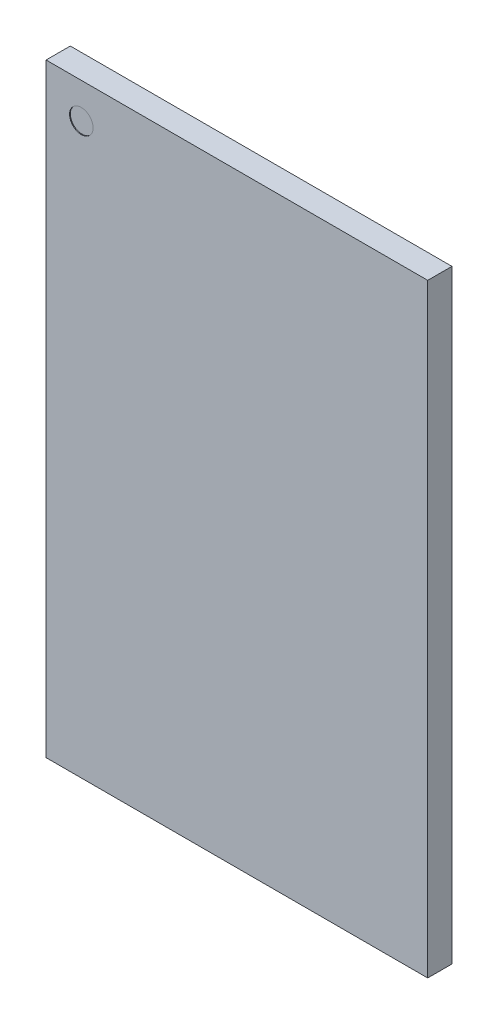
ISO-10303-21;
HEADER;
FILE_DESCRIPTION(('STEP AP214'),'2;1');
FILE_NAME('part.step','',(''),(''),'','','');
FILE_SCHEMA(('AUTOMOTIVE_DESIGN { 1 0 10303 214 1 1 1 1 }'));
ENDSEC;
DATA;
#1=APPLICATION_CONTEXT('core data for automotive mechanical design processes');
#2=APPLICATION_PROTOCOL_DEFINITION('international standard','automotive_design',2000,#1);
#3=PRODUCT_CONTEXT('',#1,'mechanical');
#4=PRODUCT('Part','Part','',(#3));
#5=PRODUCT_RELATED_PRODUCT_CATEGORY('part','',(#4));
#6=PRODUCT_DEFINITION_FORMATION('','',#4);
#7=PRODUCT_DEFINITION_CONTEXT('part definition',#1,'design');
#8=PRODUCT_DEFINITION('design','',#6,#7);
#9=PRODUCT_DEFINITION_SHAPE('','',#8);
#10=(LENGTH_UNIT() NAMED_UNIT(*) SI_UNIT(.MILLI.,.METRE.));
#11=(NAMED_UNIT(*) PLANE_ANGLE_UNIT() SI_UNIT($,.RADIAN.));
#12=(NAMED_UNIT(*) SI_UNIT($,.STERADIAN.) SOLID_ANGLE_UNIT());
#13=UNCERTAINTY_MEASURE_WITH_UNIT(LENGTH_MEASURE(1.E-05),#10,'distance_accuracy_value','');
#14=(GEOMETRIC_REPRESENTATION_CONTEXT(3) GLOBAL_UNCERTAINTY_ASSIGNED_CONTEXT((#13)) GLOBAL_UNIT_ASSIGNED_CONTEXT((#10,
#11,#12)) REPRESENTATION_CONTEXT('',''));
#15=CARTESIAN_POINT('',(0.,0.,0.));
#16=DIRECTION('',(0.,0.,1.));
#17=DIRECTION('',(1.,0.,0.));
#18=AXIS2_PLACEMENT_3D('',#15,#16,#17);
#19=CARTESIAN_POINT('',(0.,0.,0.44200000000001));
#20=DIRECTION('',(0.,0.,1.));
#21=DIRECTION('',(1.,0.,0.));
#22=AXIS2_PLACEMENT_3D('',#19,#20,#21);
#23=PLANE('',#22);
#24=CARTESIAN_POINT('',(-1.98499999999993,3.40499999999908,0.44200000000001));
#25=DIRECTION('',(0.,0.,1.));
#26=DIRECTION('',(1.,0.,0.));
#27=AXIS2_PLACEMENT_3D('',#24,#25,#26);
#28=CIRCLE('',#27,0.15000000000001);
#29=CARTESIAN_POINT('',(-1.83499999999992,3.40499999999908,0.44200000000001));
#30=VERTEX_POINT('',#29);
#31=EDGE_CURVE('E20',#30,#30,#28,.T.);
#32=ORIENTED_EDGE('',*,*,#31,.T.);
#33=EDGE_LOOP('',(#32));
#34=FACE_BOUND('',#33,.T.);
#35=ADVANCED_FACE('F17',(#34),#23,.T.);
#36=CARTESIAN_POINT('',(-1.98499999999993,3.40499999999908,0.45199999999997));
#37=DIRECTION('',(0.,0.,1.));
#38=DIRECTION('',(1.,0.,0.));
#39=AXIS2_PLACEMENT_3D('',#36,#37,#38);
#40=CYLINDRICAL_SURFACE('',#39,0.15000000000001);
#41=ORIENTED_EDGE('',*,*,#31,.F.);
#42=EDGE_LOOP('',(#41));
#43=FACE_BOUND('',#42,.T.);
#44=CARTESIAN_POINT('',(-1.98499999999993,3.40499999999908,0.45199999999997));
#45=DIRECTION('',(0.,0.,1.));
#46=DIRECTION('',(1.,0.,0.));
#47=AXIS2_PLACEMENT_3D('',#44,#45,#46);
#48=CIRCLE('',#47,0.15000000000001);
#49=CARTESIAN_POINT('',(-1.83499999999992,3.40499999999908,0.45199999999997));
#50=VERTEX_POINT('',#49);
#51=EDGE_CURVE('E75',#50,#50,#48,.F.);
#52=ORIENTED_EDGE('',*,*,#51,.F.);
#53=EDGE_LOOP('',(#52));
#54=FACE_BOUND('',#53,.T.);
#55=ADVANCED_FACE('F90',(#43,#54),#40,.F.);
#56=CARTESIAN_POINT('',(0.,0.,0.45199999999997));
#57=DIRECTION('',(0.,0.,1.));
#58=DIRECTION('',(1.,0.,0.));
#59=AXIS2_PLACEMENT_3D('',#56,#57,#58);
#60=PLANE('',#59);
#61=ORIENTED_EDGE('',*,*,#51,.T.);
#62=EDGE_LOOP('',(#61));
#63=FACE_BOUND('',#62,.T.);
#64=DIRECTION('',(1.,0.,0.));
#65=VECTOR('',#64,1.);
#66=CARTESIAN_POINT('',(2.43499999999991,3.85499999999982,0.45199999999997));
#67=LINE('',#66,#65);
#68=CARTESIAN_POINT('',(-2.43499999999991,3.85499999999982,0.45199999999997));
#69=VERTEX_POINT('',#68);
#70=CARTESIAN_POINT('',(2.43499999999991,3.85499999999982,0.45199999999997));
#71=VERTEX_POINT('',#70);
#72=EDGE_CURVE('E71',#69,#71,#67,.T.);
#73=ORIENTED_EDGE('',*,*,#72,.F.);
#74=DIRECTION('',(0.,1.,0.));
#75=VECTOR('',#74,1.);
#76=CARTESIAN_POINT('',(-2.43499999999991,3.85499999999982,0.45199999999997));
#77=LINE('',#76,#75);
#78=CARTESIAN_POINT('',(-2.43499999999991,-3.85499999999982,0.45199999999997));
#79=VERTEX_POINT('',#78);
#80=EDGE_CURVE('E67',#79,#69,#77,.T.);
#81=ORIENTED_EDGE('',*,*,#80,.F.);
#82=DIRECTION('',(1.,0.,0.));
#83=VECTOR('',#82,1.);
#84=CARTESIAN_POINT('',(-2.43499999999991,-3.85499999999982,0.45199999999997));
#85=LINE('',#84,#83);
#86=CARTESIAN_POINT('',(2.43499999999991,-3.85499999999982,0.45199999999997));
#87=VERTEX_POINT('',#86);
#88=EDGE_CURVE('E58',#87,#79,#85,.F.);
#89=ORIENTED_EDGE('',*,*,#88,.F.);
#90=DIRECTION('',(0.,1.,0.));
#91=VECTOR('',#90,1.);
#92=CARTESIAN_POINT('',(2.43499999999991,-3.85499999999982,0.45199999999997));
#93=LINE('',#92,#91);
#94=EDGE_CURVE('E53',#71,#87,#93,.F.);
#95=ORIENTED_EDGE('',*,*,#94,.F.);
#96=EDGE_LOOP('',(#73,#81,#89,#95));
#97=FACE_BOUND('',#96,.T.);
#98=ADVANCED_FACE('F70',(#63,#97),#60,.T.);
#99=CARTESIAN_POINT('',(-2.43499999999991,3.85499999999982,0.));
#100=DIRECTION('',(-1.,0.,0.));
#101=DIRECTION('',(0.,0.,1.));
#102=AXIS2_PLACEMENT_3D('',#99,#100,#101);
#103=PLANE('',#102);
#104=DIRECTION('',(0.,0.,1.));
#105=VECTOR('',#104,1.);
#106=CARTESIAN_POINT('',(-2.43499999999991,3.85499999999982,0.));
#107=LINE('',#106,#105);
#108=CARTESIAN_POINT('',(-2.43499999999991,3.85499999999982,0.143000000000012));
#109=VERTEX_POINT('',#108);
#110=EDGE_CURVE('E197',#109,#69,#107,.T.);
#111=ORIENTED_EDGE('',*,*,#110,.F.);
#112=DIRECTION('',(0.,1.,0.));
#113=VECTOR('',#112,1.);
#114=CARTESIAN_POINT('',(-2.43499999999991,0.,0.143000000000012));
#115=LINE('',#114,#113);
#116=CARTESIAN_POINT('',(-2.43499999999991,-3.85499999999982,0.143000000000012));
#117=VERTEX_POINT('',#116);
#118=EDGE_CURVE('E79',#109,#117,#115,.F.);
#119=ORIENTED_EDGE('',*,*,#118,.T.);
#120=DIRECTION('',(0.,0.,-1.));
#121=VECTOR('',#120,1.);
#122=CARTESIAN_POINT('',(-2.43499999999991,-3.85499999999982,0.));
#123=LINE('',#122,#121);
#124=EDGE_CURVE('E63',#79,#117,#123,.T.);
#125=ORIENTED_EDGE('',*,*,#124,.F.);
#126=ORIENTED_EDGE('',*,*,#80,.T.);
#127=EDGE_LOOP('',(#111,#119,#125,#126));
#128=FACE_BOUND('',#127,.T.);
#129=ADVANCED_FACE('F78',(#128),#103,.T.);
#130=CARTESIAN_POINT('',(-2.43499999999991,-3.85499999999982,0.));
#131=DIRECTION('',(0.,-1.,0.));
#132=DIRECTION('',(0.,0.,-1.));
#133=AXIS2_PLACEMENT_3D('',#130,#131,#132);
#134=PLANE('',#133);
#135=ORIENTED_EDGE('',*,*,#124,.T.);
#136=DIRECTION('',(1.,0.,0.));
#137=VECTOR('',#136,1.);
#138=CARTESIAN_POINT('',(0.,-3.85499999999982,0.143000000000012));
#139=LINE('',#138,#137);
#140=CARTESIAN_POINT('',(2.43499999999991,-3.85499999999982,0.143000000000012));
#141=VERTEX_POINT('',#140);
#142=EDGE_CURVE('E198',#117,#141,#139,.T.);
#143=ORIENTED_EDGE('',*,*,#142,.T.);
#144=DIRECTION('',(0.,0.,-1.));
#145=VECTOR('',#144,1.);
#146=CARTESIAN_POINT('',(2.43499999999991,-3.85499999999982,0.));
#147=LINE('',#146,#145);
#148=EDGE_CURVE('E65',#87,#141,#147,.T.);
#149=ORIENTED_EDGE('',*,*,#148,.F.);
#150=ORIENTED_EDGE('',*,*,#88,.T.);
#151=EDGE_LOOP('',(#135,#143,#149,#150));
#152=FACE_BOUND('',#151,.T.);
#153=ADVANCED_FACE('F60',(#152),#134,.T.);
#154=CARTESIAN_POINT('',(2.43499999999991,-3.85499999999982,0.));
#155=DIRECTION('',(1.,0.,0.));
#156=DIRECTION('',(0.,0.,-1.));
#157=AXIS2_PLACEMENT_3D('',#154,#155,#156);
#158=PLANE('',#157);
#159=ORIENTED_EDGE('',*,*,#148,.T.);
#160=DIRECTION('',(0.,1.,0.));
#161=VECTOR('',#160,1.);
#162=CARTESIAN_POINT('',(2.43499999999991,0.,0.143000000000012));
#163=LINE('',#162,#161);
#164=CARTESIAN_POINT('',(2.43499999999991,3.85499999999982,0.143000000000012));
#165=VERTEX_POINT('',#164);
#166=EDGE_CURVE('E26',#141,#165,#163,.T.);
#167=ORIENTED_EDGE('',*,*,#166,.T.);
#168=DIRECTION('',(0.,0.,1.));
#169=VECTOR('',#168,1.);
#170=CARTESIAN_POINT('',(2.43499999999991,3.85499999999982,0.));
#171=LINE('',#170,#169);
#172=EDGE_CURVE('E34',#71,#165,#171,.F.);
#173=ORIENTED_EDGE('',*,*,#172,.F.);
#174=ORIENTED_EDGE('',*,*,#94,.T.);
#175=EDGE_LOOP('',(#159,#167,#173,#174));
#176=FACE_BOUND('',#175,.T.);
#177=ADVANCED_FACE('F107',(#176),#158,.T.);
#178=CARTESIAN_POINT('',(2.43499999999991,3.85499999999982,0.));
#179=DIRECTION('',(0.,1.,0.));
#180=DIRECTION('',(0.,0.,1.));
#181=AXIS2_PLACEMENT_3D('',#178,#179,#180);
#182=PLANE('',#181);
#183=ORIENTED_EDGE('',*,*,#172,.T.);
#184=DIRECTION('',(1.,0.,0.));
#185=VECTOR('',#184,1.);
#186=CARTESIAN_POINT('',(0.,3.85499999999982,0.143000000000012));
#187=LINE('',#186,#185);
#188=EDGE_CURVE('E11',#165,#109,#187,.F.);
#189=ORIENTED_EDGE('',*,*,#188,.T.);
#190=ORIENTED_EDGE('',*,*,#110,.T.);
#191=ORIENTED_EDGE('',*,*,#72,.T.);
#192=EDGE_LOOP('',(#183,#189,#190,#191));
#193=FACE_BOUND('',#192,.T.);
#194=ADVANCED_FACE('F101',(#193),#182,.T.);
#195=CARTESIAN_POINT('',(0.,0.,0.143000000000012));
#196=DIRECTION('',(0.,0.,1.));
#197=DIRECTION('',(1.,0.,0.));
#198=AXIS2_PLACEMENT_3D('',#195,#196,#197);
#199=PLANE('',#198);
#200=ORIENTED_EDGE('',*,*,#166,.F.);
#201=ORIENTED_EDGE('',*,*,#142,.F.);
#202=ORIENTED_EDGE('',*,*,#118,.F.);
#203=ORIENTED_EDGE('',*,*,#188,.F.);
#204=EDGE_LOOP('',(#200,#201,#202,#203));
#205=FACE_BOUND('',#204,.T.);
#206=ADVANCED_FACE('F99',(#205),#199,.F.);
#207=CLOSED_SHELL('',(#35,#55,#98,#129,#153,#177,#194,#206));
#208=MANIFOLD_SOLID_BREP('B1',#207);
#209=ADVANCED_BREP_SHAPE_REPRESENTATION('',(#18,#208),#14);
#210=SHAPE_DEFINITION_REPRESENTATION(#9,#209);
ENDSEC;
END-ISO-10303-21;
